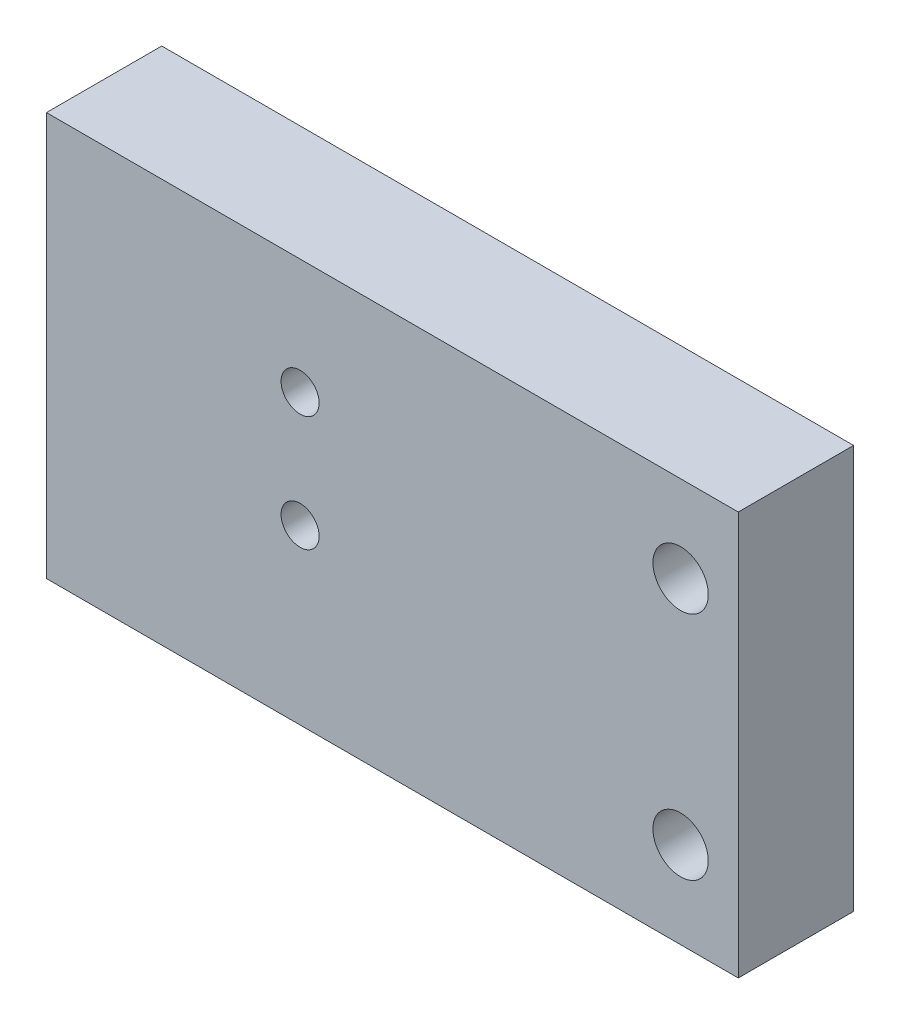
ISO-10303-21;
HEADER;
FILE_DESCRIPTION(('STEP AP214'),'2;1');
FILE_NAME('part.step','',(''),(''),'','','');
FILE_SCHEMA(('AUTOMOTIVE_DESIGN { 1 0 10303 214 1 1 1 1 }'));
ENDSEC;
DATA;
#1=APPLICATION_CONTEXT('core data for automotive mechanical design processes');
#2=APPLICATION_PROTOCOL_DEFINITION('international standard','automotive_design',2000,#1);
#3=PRODUCT_CONTEXT('',#1,'mechanical');
#4=PRODUCT('Part','Part','',(#3));
#5=PRODUCT_RELATED_PRODUCT_CATEGORY('part','',(#4));
#6=PRODUCT_DEFINITION_FORMATION('','',#4);
#7=PRODUCT_DEFINITION_CONTEXT('part definition',#1,'design');
#8=PRODUCT_DEFINITION('design','',#6,#7);
#9=PRODUCT_DEFINITION_SHAPE('','',#8);
#10=(LENGTH_UNIT() NAMED_UNIT(*) SI_UNIT(.MILLI.,.METRE.));
#11=(NAMED_UNIT(*) PLANE_ANGLE_UNIT() SI_UNIT($,.RADIAN.));
#12=(NAMED_UNIT(*) SI_UNIT($,.STERADIAN.) SOLID_ANGLE_UNIT());
#13=UNCERTAINTY_MEASURE_WITH_UNIT(LENGTH_MEASURE(1.E-05),#10,'distance_accuracy_value','');
#14=(GEOMETRIC_REPRESENTATION_CONTEXT(3) GLOBAL_UNCERTAINTY_ASSIGNED_CONTEXT((#13)) GLOBAL_UNIT_ASSIGNED_CONTEXT((#10,
#11,#12)) REPRESENTATION_CONTEXT('',''));
#15=CARTESIAN_POINT('',(0.,0.,0.));
#16=DIRECTION('',(0.,0.,1.));
#17=DIRECTION('',(1.,0.,0.));
#18=AXIS2_PLACEMENT_3D('',#15,#16,#17);
#19=CARTESIAN_POINT('',(0.,0.,10.));
#20=DIRECTION('',(1.,0.,0.));
#21=DIRECTION('',(0.,0.,-1.));
#22=AXIS2_PLACEMENT_3D('',#19,#20,#21);
#23=PLANE('',#22);
#24=DIRECTION('',(0.,-1.,0.));
#25=VECTOR('',#24,1.);
#26=CARTESIAN_POINT('',(0.,0.,0.));
#27=LINE('',#26,#25);
#28=CARTESIAN_POINT('',(0.,35.,0.));
#29=VERTEX_POINT('',#28);
#30=CARTESIAN_POINT('',(0.,0.,0.));
#31=VERTEX_POINT('',#30);
#32=EDGE_CURVE('E96',#29,#31,#27,.T.);
#33=ORIENTED_EDGE('',*,*,#32,.T.);
#34=DIRECTION('',(0.,0.,-1.));
#35=VECTOR('',#34,1.);
#36=CARTESIAN_POINT('',(0.,0.,10.));
#37=LINE('',#36,#35);
#38=CARTESIAN_POINT('',(0.,0.,10.));
#39=VERTEX_POINT('',#38);
#40=EDGE_CURVE('E11',#39,#31,#37,.T.);
#41=ORIENTED_EDGE('',*,*,#40,.F.);
#42=DIRECTION('',(0.,-1.,0.));
#43=VECTOR('',#42,1.);
#44=CARTESIAN_POINT('',(0.,0.,10.));
#45=LINE('',#44,#43);
#46=CARTESIAN_POINT('',(0.,35.,10.));
#47=VERTEX_POINT('',#46);
#48=EDGE_CURVE('E84',#47,#39,#45,.T.);
#49=ORIENTED_EDGE('',*,*,#48,.F.);
#50=DIRECTION('',(0.,0.,-1.));
#51=VECTOR('',#50,1.);
#52=CARTESIAN_POINT('',(0.,35.,10.));
#53=LINE('',#52,#51);
#54=EDGE_CURVE('E92',#47,#29,#53,.T.);
#55=ORIENTED_EDGE('',*,*,#54,.T.);
#56=EDGE_LOOP('',(#33,#41,#49,#55));
#57=FACE_BOUND('',#56,.T.);
#58=ADVANCED_FACE('F33',(#57),#23,.F.);
#59=CARTESIAN_POINT('',(0.,0.,10.));
#60=DIRECTION('',(0.,1.,0.));
#61=DIRECTION('',(0.,0.,1.));
#62=AXIS2_PLACEMENT_3D('',#59,#60,#61);
#63=PLANE('',#62);
#64=DIRECTION('',(1.,0.,0.));
#65=VECTOR('',#64,1.);
#66=CARTESIAN_POINT('',(0.,0.,0.));
#67=LINE('',#66,#65);
#68=CARTESIAN_POINT('',(60.,0.,0.));
#69=VERTEX_POINT('',#68);
#70=EDGE_CURVE('E88',#31,#69,#67,.T.);
#71=ORIENTED_EDGE('',*,*,#70,.T.);
#72=DIRECTION('',(0.,0.,-1.));
#73=VECTOR('',#72,1.);
#74=CARTESIAN_POINT('',(60.,0.,10.));
#75=LINE('',#74,#73);
#76=CARTESIAN_POINT('',(60.,0.,10.));
#77=VERTEX_POINT('',#76);
#78=EDGE_CURVE('E41',#77,#69,#75,.T.);
#79=ORIENTED_EDGE('',*,*,#78,.F.);
#80=DIRECTION('',(1.,0.,0.));
#81=VECTOR('',#80,1.);
#82=CARTESIAN_POINT('',(0.,0.,10.));
#83=LINE('',#82,#81);
#84=EDGE_CURVE('E79',#39,#77,#83,.T.);
#85=ORIENTED_EDGE('',*,*,#84,.F.);
#86=ORIENTED_EDGE('',*,*,#40,.T.);
#87=EDGE_LOOP('',(#71,#79,#85,#86));
#88=FACE_BOUND('',#87,.T.);
#89=ADVANCED_FACE('F87',(#88),#63,.F.);
#90=CARTESIAN_POINT('',(60.,0.,10.));
#91=DIRECTION('',(-1.,0.,0.));
#92=DIRECTION('',(0.,0.,1.));
#93=AXIS2_PLACEMENT_3D('',#90,#91,#92);
#94=PLANE('',#93);
#95=DIRECTION('',(0.,1.,0.));
#96=VECTOR('',#95,1.);
#97=CARTESIAN_POINT('',(60.,0.,0.));
#98=LINE('',#97,#96);
#99=CARTESIAN_POINT('',(60.,35.,0.));
#100=VERTEX_POINT('',#99);
#101=EDGE_CURVE('E66',#69,#100,#98,.T.);
#102=ORIENTED_EDGE('',*,*,#101,.T.);
#103=DIRECTION('',(0.,0.,-1.));
#104=VECTOR('',#103,1.);
#105=CARTESIAN_POINT('',(60.,35.,10.));
#106=LINE('',#105,#104);
#107=CARTESIAN_POINT('',(60.,35.,10.));
#108=VERTEX_POINT('',#107);
#109=EDGE_CURVE('E89',#108,#100,#106,.T.);
#110=ORIENTED_EDGE('',*,*,#109,.F.);
#111=DIRECTION('',(0.,1.,0.));
#112=VECTOR('',#111,1.);
#113=CARTESIAN_POINT('',(60.,0.,10.));
#114=LINE('',#113,#112);
#115=EDGE_CURVE('E82',#77,#108,#114,.T.);
#116=ORIENTED_EDGE('',*,*,#115,.F.);
#117=ORIENTED_EDGE('',*,*,#78,.T.);
#118=EDGE_LOOP('',(#102,#110,#116,#117));
#119=FACE_BOUND('',#118,.T.);
#120=ADVANCED_FACE('F90',(#119),#94,.F.);
#121=CARTESIAN_POINT('',(0.,35.,10.));
#122=DIRECTION('',(0.,-1.,0.));
#123=DIRECTION('',(0.,0.,-1.));
#124=AXIS2_PLACEMENT_3D('',#121,#122,#123);
#125=PLANE('',#124);
#126=DIRECTION('',(-1.,0.,0.));
#127=VECTOR('',#126,1.);
#128=CARTESIAN_POINT('',(0.,35.,0.));
#129=LINE('',#128,#127);
#130=EDGE_CURVE('E72',#100,#29,#129,.T.);
#131=ORIENTED_EDGE('',*,*,#130,.T.);
#132=ORIENTED_EDGE('',*,*,#54,.F.);
#133=DIRECTION('',(-1.,0.,0.));
#134=VECTOR('',#133,1.);
#135=CARTESIAN_POINT('',(0.,35.,10.));
#136=LINE('',#135,#134);
#137=EDGE_CURVE('E49',#108,#47,#136,.T.);
#138=ORIENTED_EDGE('',*,*,#137,.F.);
#139=ORIENTED_EDGE('',*,*,#109,.T.);
#140=EDGE_LOOP('',(#131,#132,#138,#139));
#141=FACE_BOUND('',#140,.T.);
#142=ADVANCED_FACE('F104',(#141),#125,.F.);
#143=CARTESIAN_POINT('',(0.,35.,10.));
#144=DIRECTION('',(0.,0.,-1.));
#145=DIRECTION('',(-1.,0.,0.));
#146=AXIS2_PLACEMENT_3D('',#143,#144,#145);
#147=PLANE('',#146);
#148=CARTESIAN_POINT('',(22.,25.,10.));
#149=DIRECTION('',(0.,0.,-1.));
#150=DIRECTION('',(-1.,0.,0.));
#151=AXIS2_PLACEMENT_3D('',#148,#149,#150);
#152=CIRCLE('',#151,1.65);
#153=CARTESIAN_POINT('',(20.35,25.,10.));
#154=VERTEX_POINT('',#153);
#155=EDGE_CURVE('E139',#154,#154,#152,.T.);
#156=ORIENTED_EDGE('',*,*,#155,.T.);
#157=EDGE_LOOP('',(#156));
#158=FACE_BOUND('',#157,.T.);
#159=CARTESIAN_POINT('',(22.,15.,10.));
#160=DIRECTION('',(0.,0.,-1.));
#161=DIRECTION('',(-1.,0.,0.));
#162=AXIS2_PLACEMENT_3D('',#159,#160,#161);
#163=CIRCLE('',#162,1.65);
#164=CARTESIAN_POINT('',(20.35,15.,10.));
#165=VERTEX_POINT('',#164);
#166=EDGE_CURVE('E133',#165,#165,#163,.T.);
#167=ORIENTED_EDGE('',*,*,#166,.T.);
#168=EDGE_LOOP('',(#167));
#169=FACE_BOUND('',#168,.T.);
#170=CARTESIAN_POINT('',(55.,7.5,10.));
#171=DIRECTION('',(0.,0.,-1.));
#172=DIRECTION('',(-1.,0.,0.));
#173=AXIS2_PLACEMENT_3D('',#170,#171,#172);
#174=CIRCLE('',#173,2.4);
#175=CARTESIAN_POINT('',(52.6,7.5,10.));
#176=VERTEX_POINT('',#175);
#177=EDGE_CURVE('E121',#176,#176,#174,.T.);
#178=ORIENTED_EDGE('',*,*,#177,.T.);
#179=EDGE_LOOP('',(#178));
#180=FACE_BOUND('',#179,.T.);
#181=CARTESIAN_POINT('',(55.,27.5,10.));
#182=DIRECTION('',(0.,0.,-1.));
#183=DIRECTION('',(-1.,0.,0.));
#184=AXIS2_PLACEMENT_3D('',#181,#182,#183);
#185=CIRCLE('',#184,2.4);
#186=CARTESIAN_POINT('',(52.6,27.5,10.));
#187=VERTEX_POINT('',#186);
#188=EDGE_CURVE('E99',#187,#187,#185,.T.);
#189=ORIENTED_EDGE('',*,*,#188,.T.);
#190=EDGE_LOOP('',(#189));
#191=FACE_BOUND('',#190,.T.);
#192=ORIENTED_EDGE('',*,*,#48,.T.);
#193=ORIENTED_EDGE('',*,*,#84,.T.);
#194=ORIENTED_EDGE('',*,*,#115,.T.);
#195=ORIENTED_EDGE('',*,*,#137,.T.);
#196=EDGE_LOOP('',(#192,#193,#194,#195));
#197=FACE_BOUND('',#196,.T.);
#198=ADVANCED_FACE('F80',(#158,#169,#180,#191,#197),#147,.F.);
#199=CARTESIAN_POINT('',(0.,35.,0.));
#200=DIRECTION('',(0.,0.,-1.));
#201=DIRECTION('',(-1.,0.,0.));
#202=AXIS2_PLACEMENT_3D('',#199,#200,#201);
#203=PLANE('',#202);
#204=CARTESIAN_POINT('',(22.,25.,0.));
#205=DIRECTION('',(0.,0.,-1.));
#206=DIRECTION('',(-1.,0.,0.));
#207=AXIS2_PLACEMENT_3D('',#204,#205,#206);
#208=CIRCLE('',#207,1.64999999999999);
#209=CARTESIAN_POINT('',(20.35,25.,0.));
#210=VERTEX_POINT('',#209);
#211=EDGE_CURVE('E142',#210,#210,#208,.T.);
#212=ORIENTED_EDGE('',*,*,#211,.F.);
#213=EDGE_LOOP('',(#212));
#214=FACE_BOUND('',#213,.T.);
#215=CARTESIAN_POINT('',(22.,15.,0.));
#216=DIRECTION('',(0.,0.,-1.));
#217=DIRECTION('',(-1.,0.,0.));
#218=AXIS2_PLACEMENT_3D('',#215,#216,#217);
#219=CIRCLE('',#218,1.64999999999999);
#220=CARTESIAN_POINT('',(20.35,15.,0.));
#221=VERTEX_POINT('',#220);
#222=EDGE_CURVE('E136',#221,#221,#219,.T.);
#223=ORIENTED_EDGE('',*,*,#222,.F.);
#224=EDGE_LOOP('',(#223));
#225=FACE_BOUND('',#224,.T.);
#226=CARTESIAN_POINT('',(55.,7.5,0.));
#227=DIRECTION('',(0.,0.,-1.));
#228=DIRECTION('',(-1.,0.,0.));
#229=AXIS2_PLACEMENT_3D('',#226,#227,#228);
#230=CIRCLE('',#229,4.);
#231=CARTESIAN_POINT('',(51.,7.5,0.));
#232=VERTEX_POINT('',#231);
#233=EDGE_CURVE('E130',#232,#232,#230,.T.);
#234=ORIENTED_EDGE('',*,*,#233,.F.);
#235=EDGE_LOOP('',(#234));
#236=FACE_BOUND('',#235,.T.);
#237=CARTESIAN_POINT('',(55.,27.5,0.));
#238=DIRECTION('',(0.,0.,-1.));
#239=DIRECTION('',(-1.,0.,0.));
#240=AXIS2_PLACEMENT_3D('',#237,#238,#239);
#241=CIRCLE('',#240,4.);
#242=CARTESIAN_POINT('',(51.,27.5,0.));
#243=VERTEX_POINT('',#242);
#244=EDGE_CURVE('E118',#243,#243,#241,.T.);
#245=ORIENTED_EDGE('',*,*,#244,.F.);
#246=EDGE_LOOP('',(#245));
#247=FACE_BOUND('',#246,.T.);
#248=ORIENTED_EDGE('',*,*,#32,.F.);
#249=ORIENTED_EDGE('',*,*,#130,.F.);
#250=ORIENTED_EDGE('',*,*,#101,.F.);
#251=ORIENTED_EDGE('',*,*,#70,.F.);
#252=EDGE_LOOP('',(#248,#249,#250,#251));
#253=FACE_BOUND('',#252,.T.);
#254=ADVANCED_FACE('F107',(#214,#225,#236,#247,#253),#203,.T.);
#255=CARTESIAN_POINT('',(55.,27.5,0.));
#256=DIRECTION('',(0.,0.,-1.));
#257=DIRECTION('',(-1.,0.,0.));
#258=AXIS2_PLACEMENT_3D('',#255,#256,#257);
#259=CYLINDRICAL_SURFACE('',#258,2.4);
#260=ORIENTED_EDGE('',*,*,#188,.F.);
#261=EDGE_LOOP('',(#260));
#262=FACE_BOUND('',#261,.T.);
#263=CARTESIAN_POINT('',(55.,27.5,4.));
#264=DIRECTION('',(0.,0.,-1.));
#265=DIRECTION('',(-1.,0.,0.));
#266=AXIS2_PLACEMENT_3D('',#263,#264,#265);
#267=CIRCLE('',#266,2.4);
#268=CARTESIAN_POINT('',(52.6,27.5,4.));
#269=VERTEX_POINT('',#268);
#270=EDGE_CURVE('E112',#269,#269,#267,.T.);
#271=ORIENTED_EDGE('',*,*,#270,.T.);
#272=EDGE_LOOP('',(#271));
#273=FACE_BOUND('',#272,.T.);
#274=ADVANCED_FACE('F150',(#262,#273),#259,.F.);
#275=CARTESIAN_POINT('',(57.4,27.5,4.));
#276=DIRECTION('',(0.,0.,1.));
#277=DIRECTION('',(1.,0.,0.));
#278=AXIS2_PLACEMENT_3D('',#275,#276,#277);
#279=PLANE('',#278);
#280=ORIENTED_EDGE('',*,*,#270,.F.);
#281=EDGE_LOOP('',(#280));
#282=FACE_BOUND('',#281,.T.);
#283=CARTESIAN_POINT('',(55.,27.5,4.));
#284=DIRECTION('',(0.,0.,-1.));
#285=DIRECTION('',(-1.,0.,0.));
#286=AXIS2_PLACEMENT_3D('',#283,#284,#285);
#287=CIRCLE('',#286,4.);
#288=CARTESIAN_POINT('',(51.,27.5,4.));
#289=VERTEX_POINT('',#288);
#290=EDGE_CURVE('E115',#289,#289,#287,.T.);
#291=ORIENTED_EDGE('',*,*,#290,.T.);
#292=EDGE_LOOP('',(#291));
#293=FACE_BOUND('',#292,.T.);
#294=ADVANCED_FACE('F161',(#282,#293),#279,.F.);
#295=CARTESIAN_POINT('',(55.,27.5,0.));
#296=DIRECTION('',(0.,0.,-1.));
#297=DIRECTION('',(-1.,0.,0.));
#298=AXIS2_PLACEMENT_3D('',#295,#296,#297);
#299=CYLINDRICAL_SURFACE('',#298,4.);
#300=ORIENTED_EDGE('',*,*,#290,.F.);
#301=EDGE_LOOP('',(#300));
#302=FACE_BOUND('',#301,.T.);
#303=ORIENTED_EDGE('',*,*,#244,.T.);
#304=EDGE_LOOP('',(#303));
#305=FACE_BOUND('',#304,.T.);
#306=ADVANCED_FACE('F158',(#302,#305),#299,.F.);
#307=CARTESIAN_POINT('',(55.,7.5,0.));
#308=DIRECTION('',(0.,0.,-1.));
#309=DIRECTION('',(-1.,0.,0.));
#310=AXIS2_PLACEMENT_3D('',#307,#308,#309);
#311=CYLINDRICAL_SURFACE('',#310,2.4);
#312=ORIENTED_EDGE('',*,*,#177,.F.);
#313=EDGE_LOOP('',(#312));
#314=FACE_BOUND('',#313,.T.);
#315=CARTESIAN_POINT('',(55.,7.5,4.));
#316=DIRECTION('',(0.,0.,-1.));
#317=DIRECTION('',(-1.,0.,0.));
#318=AXIS2_PLACEMENT_3D('',#315,#316,#317);
#319=CIRCLE('',#318,2.4);
#320=CARTESIAN_POINT('',(52.6,7.5,4.));
#321=VERTEX_POINT('',#320);
#322=EDGE_CURVE('E124',#321,#321,#319,.T.);
#323=ORIENTED_EDGE('',*,*,#322,.T.);
#324=EDGE_LOOP('',(#323));
#325=FACE_BOUND('',#324,.T.);
#326=ADVANCED_FACE('F160',(#314,#325),#311,.F.);
#327=CARTESIAN_POINT('',(57.4,7.5,4.));
#328=DIRECTION('',(0.,0.,1.));
#329=DIRECTION('',(1.,0.,0.));
#330=AXIS2_PLACEMENT_3D('',#327,#328,#329);
#331=PLANE('',#330);
#332=ORIENTED_EDGE('',*,*,#322,.F.);
#333=EDGE_LOOP('',(#332));
#334=FACE_BOUND('',#333,.T.);
#335=CARTESIAN_POINT('',(55.,7.5,4.));
#336=DIRECTION('',(0.,0.,-1.));
#337=DIRECTION('',(-1.,0.,0.));
#338=AXIS2_PLACEMENT_3D('',#335,#336,#337);
#339=CIRCLE('',#338,4.);
#340=CARTESIAN_POINT('',(51.,7.5,4.));
#341=VERTEX_POINT('',#340);
#342=EDGE_CURVE('E127',#341,#341,#339,.T.);
#343=ORIENTED_EDGE('',*,*,#342,.T.);
#344=EDGE_LOOP('',(#343));
#345=FACE_BOUND('',#344,.T.);
#346=ADVANCED_FACE('F168',(#334,#345),#331,.F.);
#347=CARTESIAN_POINT('',(55.,7.5,0.));
#348=DIRECTION('',(0.,0.,-1.));
#349=DIRECTION('',(-1.,0.,0.));
#350=AXIS2_PLACEMENT_3D('',#347,#348,#349);
#351=CYLINDRICAL_SURFACE('',#350,4.);
#352=ORIENTED_EDGE('',*,*,#342,.F.);
#353=EDGE_LOOP('',(#352));
#354=FACE_BOUND('',#353,.T.);
#355=ORIENTED_EDGE('',*,*,#233,.T.);
#356=EDGE_LOOP('',(#355));
#357=FACE_BOUND('',#356,.T.);
#358=ADVANCED_FACE('F223',(#354,#357),#351,.F.);
#359=CARTESIAN_POINT('',(22.,15.,0.));
#360=DIRECTION('',(0.,0.,-1.));
#361=DIRECTION('',(-1.,0.,0.));
#362=AXIS2_PLACEMENT_3D('',#359,#360,#361);
#363=CYLINDRICAL_SURFACE('',#362,1.64999999999999);
#364=ORIENTED_EDGE('',*,*,#166,.F.);
#365=EDGE_LOOP('',(#364));
#366=FACE_BOUND('',#365,.T.);
#367=ORIENTED_EDGE('',*,*,#222,.T.);
#368=EDGE_LOOP('',(#367));
#369=FACE_BOUND('',#368,.T.);
#370=ADVANCED_FACE('F233',(#366,#369),#363,.F.);
#371=CARTESIAN_POINT('',(22.,25.,0.));
#372=DIRECTION('',(0.,0.,-1.));
#373=DIRECTION('',(-1.,0.,0.));
#374=AXIS2_PLACEMENT_3D('',#371,#372,#373);
#375=CYLINDRICAL_SURFACE('',#374,1.64999999999999);
#376=ORIENTED_EDGE('',*,*,#155,.F.);
#377=EDGE_LOOP('',(#376));
#378=FACE_BOUND('',#377,.T.);
#379=ORIENTED_EDGE('',*,*,#211,.T.);
#380=EDGE_LOOP('',(#379));
#381=FACE_BOUND('',#380,.T.);
#382=ADVANCED_FACE('F146',(#378,#381),#375,.F.);
#383=CLOSED_SHELL('',(#58,#89,#120,#142,#198,#254,#274,#294,#306,#326,#346,#358,#370,#382));
#384=MANIFOLD_SOLID_BREP('B2',#383);
#385=ADVANCED_BREP_SHAPE_REPRESENTATION('',(#18,#384),#14);
#386=SHAPE_DEFINITION_REPRESENTATION(#9,#385);
ENDSEC;
END-ISO-10303-21;
